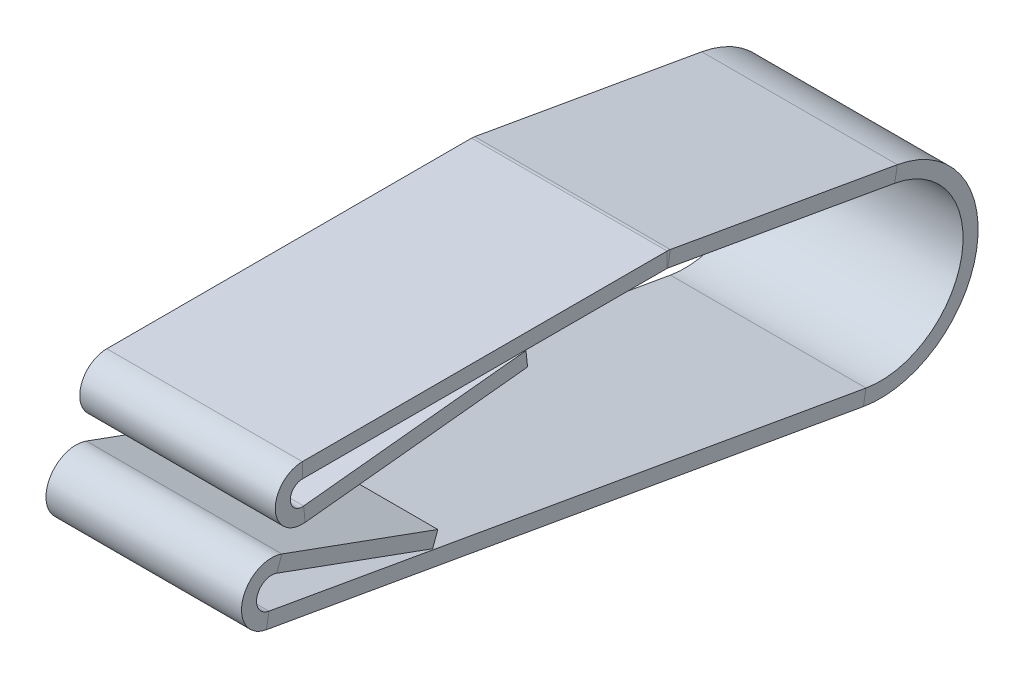
ISO-10303-21;
HEADER;
FILE_DESCRIPTION(('STEP AP214'),'2;1');
FILE_NAME('part.step','',(''),(''),'','','');
FILE_SCHEMA(('AUTOMOTIVE_DESIGN { 1 0 10303 214 1 1 1 1 }'));
ENDSEC;
DATA;
#1=APPLICATION_CONTEXT('core data for automotive mechanical design processes');
#2=APPLICATION_PROTOCOL_DEFINITION('international standard','automotive_design',2000,#1);
#3=PRODUCT_CONTEXT('',#1,'mechanical');
#4=PRODUCT('Part','Part','',(#3));
#5=PRODUCT_RELATED_PRODUCT_CATEGORY('part','',(#4));
#6=PRODUCT_DEFINITION_FORMATION('','',#4);
#7=PRODUCT_DEFINITION_CONTEXT('part definition',#1,'design');
#8=PRODUCT_DEFINITION('design','',#6,#7);
#9=PRODUCT_DEFINITION_SHAPE('','',#8);
#10=(LENGTH_UNIT() NAMED_UNIT(*) SI_UNIT(.MILLI.,.METRE.));
#11=(NAMED_UNIT(*) PLANE_ANGLE_UNIT() SI_UNIT($,.RADIAN.));
#12=(NAMED_UNIT(*) SI_UNIT($,.STERADIAN.) SOLID_ANGLE_UNIT());
#13=UNCERTAINTY_MEASURE_WITH_UNIT(LENGTH_MEASURE(1.E-05),#10,'distance_accuracy_value','');
#14=(GEOMETRIC_REPRESENTATION_CONTEXT(3) GLOBAL_UNCERTAINTY_ASSIGNED_CONTEXT((#13)) GLOBAL_UNIT_ASSIGNED_CONTEXT((#10,
#11,#12)) REPRESENTATION_CONTEXT('',''));
#15=CARTESIAN_POINT('',(0.,0.,0.));
#16=DIRECTION('',(0.,0.,1.));
#17=DIRECTION('',(1.,0.,0.));
#18=AXIS2_PLACEMENT_3D('',#15,#16,#17);
#19=CARTESIAN_POINT('',(-10.8534610219836,6.,-23.8564612972341));
#20=DIRECTION('',(1.,0.,0.));
#21=DIRECTION('',(0.,0.,-1.));
#22=AXIS2_PLACEMENT_3D('',#19,#20,#21);
#23=PLANE('',#22);
#24=DIRECTION('',(0.,0.,1.));
#25=VECTOR('',#24,1.);
#26=CARTESIAN_POINT('',(-10.8534610219836,5.5,-23.8564612972341));
#27=LINE('',#26,#25);
#28=CARTESIAN_POINT('',(-10.8534610219836,5.5,-14.3814612972341));
#29=VERTEX_POINT('',#28);
#30=CARTESIAN_POINT('',(-10.8534610219836,5.5,-26.5070840844616));
#31=VERTEX_POINT('',#30);
#32=EDGE_CURVE('E308',#29,#31,#27,.F.);
#33=ORIENTED_EDGE('',*,*,#32,.F.);
#34=DIRECTION('',(0.,1.,0.));
#35=VECTOR('',#34,1.);
#36=CARTESIAN_POINT('',(-10.8534610219836,5.50000000000003,-14.3814612972341));
#37=LINE('',#36,#35);
#38=CARTESIAN_POINT('',(-10.8534610219836,6.00000000000003,-14.3814612972341));
#39=VERTEX_POINT('',#38);
#40=EDGE_CURVE('E203',#29,#39,#37,.T.);
#41=ORIENTED_EDGE('',*,*,#40,.T.);
#42=DIRECTION('',(0.,0.,-1.));
#43=VECTOR('',#42,1.);
#44=CARTESIAN_POINT('',(-10.8534610219836,6.,-23.8564612972341));
#45=LINE('',#44,#43);
#46=CARTESIAN_POINT('',(-10.8534610219836,6.,-26.5070840844616));
#47=VERTEX_POINT('',#46);
#48=EDGE_CURVE('E228',#39,#47,#45,.T.);
#49=ORIENTED_EDGE('',*,*,#48,.T.);
#50=DIRECTION('',(0.,1.,0.));
#51=VECTOR('',#50,1.);
#52=CARTESIAN_POINT('',(-10.8534610219836,6.,-26.5070840844616));
#53=LINE('',#52,#51);
#54=EDGE_CURVE('E313',#31,#47,#53,.T.);
#55=ORIENTED_EDGE('',*,*,#54,.F.);
#56=EDGE_LOOP('',(#33,#41,#49,#55));
#57=FACE_BOUND('',#56,.T.);
#58=ADVANCED_FACE('F48',(#57),#23,.F.);
#59=CARTESIAN_POINT('',(-10.8534610219836,6.46176803203314,-23.940760637627));
#60=DIRECTION('',(1.,0.,0.));
#61=DIRECTION('',(0.,-0.173648177666931,-0.984807753012208));
#62=AXIS2_PLACEMENT_3D('',#59,#60,#61);
#63=PLANE('',#62);
#64=DIRECTION('',(0.,0.173648177666931,0.984807753012208));
#65=VECTOR('',#64,1.);
#66=CARTESIAN_POINT('',(-10.8534610219836,5.96936415552703,-23.8539365487936));
#67=LINE('',#66,#65);
#68=CARTESIAN_POINT('',(-10.8534610219835,5.49848077530122,-26.5244489022283));
#69=VERTEX_POINT('',#68);
#70=CARTESIAN_POINT('',(-10.8534610219836,4.16776431223263,-34.0713169862952));
#71=VERTEX_POINT('',#70);
#72=EDGE_CURVE('E360',#69,#71,#67,.F.);
#73=ORIENTED_EDGE('',*,*,#72,.F.);
#74=DIRECTION('',(0.,0.984807753012208,-0.173648177666931));
#75=VECTOR('',#74,1.);
#76=CARTESIAN_POINT('',(-10.8534610219836,5.99088465180732,-26.6112729910618));
#77=LINE('',#76,#75);
#78=CARTESIAN_POINT('',(-10.8534610219836,5.99088465180732,-26.6112729910618));
#79=VERTEX_POINT('',#78);
#80=EDGE_CURVE('E461',#69,#79,#77,.T.);
#81=ORIENTED_EDGE('',*,*,#80,.T.);
#82=DIRECTION('',(0.,-0.173648177666931,-0.984807753012208));
#83=VECTOR('',#82,1.);
#84=CARTESIAN_POINT('',(-10.8534610219836,6.46176803203314,-23.940760637627));
#85=LINE('',#84,#83);
#86=CARTESIAN_POINT('',(-10.8534610219836,4.66016818873873,-34.1581410751287));
#87=VERTEX_POINT('',#86);
#88=EDGE_CURVE('E52',#79,#87,#85,.T.);
#89=ORIENTED_EDGE('',*,*,#88,.T.);
#90=DIRECTION('',(0.,0.984807753012208,-0.173648177666931));
#91=VECTOR('',#90,1.);
#92=CARTESIAN_POINT('',(-10.8534610219836,4.66016818873873,-34.1581410751287));
#93=LINE('',#92,#91);
#94=EDGE_CURVE('E361',#71,#87,#93,.T.);
#95=ORIENTED_EDGE('',*,*,#94,.F.);
#96=EDGE_LOOP('',(#73,#81,#89,#95));
#97=FACE_BOUND('',#96,.T.);
#98=ADVANCED_FACE('F481',(#97),#63,.F.);
#99=CARTESIAN_POINT('',(-4.35346102198356,6.46176803203314,-23.940760637627));
#100=DIRECTION('',(-1.,0.,0.));
#101=DIRECTION('',(0.,0.173648177666931,0.984807753012208));
#102=AXIS2_PLACEMENT_3D('',#99,#100,#101);
#103=PLANE('',#102);
#104=DIRECTION('',(0.,0.173648177666931,0.984807753012208));
#105=VECTOR('',#104,1.);
#106=CARTESIAN_POINT('',(-4.35346102198356,6.46176803203314,-23.940760637627));
#107=LINE('',#106,#105);
#108=CARTESIAN_POINT('',(-4.35346102198356,4.66016818873873,-34.1581410751287));
#109=VERTEX_POINT('',#108);
#110=CARTESIAN_POINT('',(-4.35346102198356,5.99088465180732,-26.6112729910618));
#111=VERTEX_POINT('',#110);
#112=EDGE_CURVE('E356',#109,#111,#107,.T.);
#113=ORIENTED_EDGE('',*,*,#112,.T.);
#114=DIRECTION('',(0.,-0.984807753012208,0.173648177666931));
#115=VECTOR('',#114,1.);
#116=CARTESIAN_POINT('',(-4.35346102198356,5.99088465180732,-26.6112729910618));
#117=LINE('',#116,#115);
#118=CARTESIAN_POINT('',(-4.35346102198356,5.49848077530122,-26.5244489022283));
#119=VERTEX_POINT('',#118);
#120=EDGE_CURVE('E12',#111,#119,#117,.T.);
#121=ORIENTED_EDGE('',*,*,#120,.T.);
#122=DIRECTION('',(0.,0.173648177666931,0.984807753012208));
#123=VECTOR('',#122,1.);
#124=CARTESIAN_POINT('',(-4.35346102198356,5.96936415552703,-23.8539365487936));
#125=LINE('',#124,#123);
#126=CARTESIAN_POINT('',(-4.35346102198356,4.16776431223263,-34.0713169862952));
#127=VERTEX_POINT('',#126);
#128=EDGE_CURVE('E349',#127,#119,#125,.T.);
#129=ORIENTED_EDGE('',*,*,#128,.F.);
#130=DIRECTION('',(0.,0.984807753012208,-0.173648177666931));
#131=VECTOR('',#130,1.);
#132=CARTESIAN_POINT('',(-4.35346102198356,4.66016818873873,-34.1581410751287));
#133=LINE('',#132,#131);
#134=EDGE_CURVE('E365',#127,#109,#133,.T.);
#135=ORIENTED_EDGE('',*,*,#134,.T.);
#136=EDGE_LOOP('',(#113,#121,#129,#135));
#137=FACE_BOUND('',#136,.T.);
#138=ADVANCED_FACE('F50',(#137),#103,.F.);
#139=CARTESIAN_POINT('',(-7.60346102198356,6.46176803203314,-23.940760637627));
#140=DIRECTION('',(0.,0.984807753012208,-0.173648177666931));
#141=DIRECTION('',(0.,0.173648177666931,0.984807753012208));
#142=AXIS2_PLACEMENT_3D('',#139,#140,#141);
#143=PLANE('',#142);
#144=ORIENTED_EDGE('',*,*,#88,.F.);
#145=DIRECTION('',(1.,0.,0.));
#146=VECTOR('',#145,1.);
#147=CARTESIAN_POINT('',(-7.60346102198356,5.99088465180732,-26.6112729910618));
#148=LINE('',#147,#146);
#149=EDGE_CURVE('E453',#79,#111,#148,.T.);
#150=ORIENTED_EDGE('',*,*,#149,.T.);
#151=ORIENTED_EDGE('',*,*,#112,.F.);
#152=DIRECTION('',(1.,0.,0.));
#153=VECTOR('',#152,1.);
#154=CARTESIAN_POINT('',(-7.60346102198356,4.66016818873873,-34.1581410751287));
#155=LINE('',#154,#153);
#156=EDGE_CURVE('E352',#87,#109,#155,.T.);
#157=ORIENTED_EDGE('',*,*,#156,.F.);
#158=EDGE_LOOP('',(#144,#150,#151,#157));
#159=FACE_BOUND('',#158,.T.);
#160=ADVANCED_FACE('F582',(#159),#143,.T.);
#161=CARTESIAN_POINT('',(-10.8534610219836,1.93157675181497,-12.2007439440854));
#162=DIRECTION('',(-1.,0.,0.));
#163=DIRECTION('',(0.,0.173648177666931,0.984807753012208));
#164=AXIS2_PLACEMENT_3D('',#161,#162,#163);
#165=PLANE('',#164);
#166=DIRECTION('',(0.,0.173648177666931,0.984807753012208));
#167=VECTOR('',#166,1.);
#168=CARTESIAN_POINT('',(-10.8534610219836,2.42398062832107,-12.2875680329189));
#169=LINE('',#168,#167);
#170=CARTESIAN_POINT('',(-10.8534610219836,-1.24867832933452,-33.1162520091271));
#171=VERTEX_POINT('',#170);
#172=CARTESIAN_POINT('',(-10.8534610219836,2.25033245065416,-13.2723757859311));
#173=VERTEX_POINT('',#172);
#174=EDGE_CURVE('E450',#171,#173,#169,.T.);
#175=ORIENTED_EDGE('',*,*,#174,.F.);
#176=DIRECTION('',(0.,-0.984807753012208,0.173648177666931));
#177=VECTOR('',#176,1.);
#178=CARTESIAN_POINT('',(-10.8534610219836,-1.24867832933452,-33.1162520091271));
#179=LINE('',#178,#177);
#180=CARTESIAN_POINT('',(-10.8534610219836,-1.74108220584062,-33.0294279202936));
#181=VERTEX_POINT('',#180);
#182=EDGE_CURVE('E330',#171,#181,#179,.T.);
#183=ORIENTED_EDGE('',*,*,#182,.T.);
#184=DIRECTION('',(0.,0.173648177666931,0.984807753012208));
#185=VECTOR('',#184,1.);
#186=CARTESIAN_POINT('',(-10.8534610219836,1.93157675181497,-12.2007439440854));
#187=LINE('',#186,#185);
#188=CARTESIAN_POINT('',(-10.8534610219836,1.75792857414805,-13.1855516970976));
#189=VERTEX_POINT('',#188);
#190=EDGE_CURVE('E449',#181,#189,#187,.T.);
#191=ORIENTED_EDGE('',*,*,#190,.T.);
#192=DIRECTION('',(0.,-0.984807753012208,0.173648177666931));
#193=VECTOR('',#192,1.);
#194=CARTESIAN_POINT('',(-10.8534610219836,2.25033245065416,-13.2723757859311));
#195=LINE('',#194,#193);
#196=EDGE_CURVE('E394',#173,#189,#195,.T.);
#197=ORIENTED_EDGE('',*,*,#196,.F.);
#198=EDGE_LOOP('',(#175,#183,#191,#197));
#199=FACE_BOUND('',#198,.T.);
#200=ADVANCED_FACE('F495',(#199),#165,.T.);
#201=CARTESIAN_POINT('',(-4.35346102198356,1.93157675181497,-12.2007439440854));
#202=DIRECTION('',(1.,0.,0.));
#203=DIRECTION('',(0.,-0.173648177666931,-0.984807753012208));
#204=AXIS2_PLACEMENT_3D('',#201,#202,#203);
#205=PLANE('',#204);
#206=DIRECTION('',(0.,-0.984807753012208,0.173648177666931));
#207=VECTOR('',#206,1.);
#208=CARTESIAN_POINT('',(-4.35346102198356,-1.24867832933452,-33.1162520091271));
#209=LINE('',#208,#207);
#210=CARTESIAN_POINT('',(-4.35346102198356,-1.24867832933452,-33.1162520091271));
#211=VERTEX_POINT('',#210);
#212=CARTESIAN_POINT('',(-4.35346102198356,-1.74108220584062,-33.0294279202936));
#213=VERTEX_POINT('',#212);
#214=EDGE_CURVE('E345',#211,#213,#209,.T.);
#215=ORIENTED_EDGE('',*,*,#214,.F.);
#216=DIRECTION('',(0.,-0.173648177666931,-0.984807753012208));
#217=VECTOR('',#216,1.);
#218=CARTESIAN_POINT('',(-4.35346102198356,2.42398062832107,-12.2875680329189));
#219=LINE('',#218,#217);
#220=CARTESIAN_POINT('',(-4.35346102198356,2.25033245065414,-13.2723757859311));
#221=VERTEX_POINT('',#220);
#222=EDGE_CURVE('E443',#221,#211,#219,.T.);
#223=ORIENTED_EDGE('',*,*,#222,.F.);
#224=DIRECTION('',(0.,-0.984807753012208,0.173648177666931));
#225=VECTOR('',#224,1.);
#226=CARTESIAN_POINT('',(-4.35346102198356,2.25033245065416,-13.2723757859311));
#227=LINE('',#226,#225);
#228=CARTESIAN_POINT('',(-4.35346102198356,1.75792857414803,-13.1855516970976));
#229=VERTEX_POINT('',#228);
#230=EDGE_CURVE('E379',#221,#229,#227,.T.);
#231=ORIENTED_EDGE('',*,*,#230,.T.);
#232=DIRECTION('',(0.,-0.173648177666931,-0.984807753012208));
#233=VECTOR('',#232,1.);
#234=CARTESIAN_POINT('',(-4.35346102198356,1.93157675181497,-12.2007439440854));
#235=LINE('',#234,#233);
#236=EDGE_CURVE('E446',#229,#213,#235,.T.);
#237=ORIENTED_EDGE('',*,*,#236,.T.);
#238=EDGE_LOOP('',(#215,#223,#231,#237));
#239=FACE_BOUND('',#238,.T.);
#240=ADVANCED_FACE('F511',(#239),#205,.T.);
#241=CARTESIAN_POINT('',(0.,4.20314866730016,0.681980562159884));
#242=DIRECTION('',(0.,0.984807753012208,-0.173648177666931));
#243=DIRECTION('',(0.,0.173648177666931,0.984807753012208));
#244=AXIS2_PLACEMENT_3D('',#241,#242,#243);
#245=PLANE('',#244);
#246=ORIENTED_EDGE('',*,*,#190,.F.);
#247=DIRECTION('',(-1.,0.,0.));
#248=VECTOR('',#247,1.);
#249=CARTESIAN_POINT('',(-10.8534610219836,-1.74108220584062,-33.0294279202936));
#250=LINE('',#249,#248);
#251=EDGE_CURVE('E321',#181,#213,#250,.F.);
#252=ORIENTED_EDGE('',*,*,#251,.T.);
#253=ORIENTED_EDGE('',*,*,#236,.F.);
#254=DIRECTION('',(1.,0.,0.));
#255=VECTOR('',#254,1.);
#256=CARTESIAN_POINT('',(-4.35346102198356,1.75792857414805,-13.1855516970976));
#257=LINE('',#256,#255);
#258=EDGE_CURVE('E370',#229,#189,#257,.F.);
#259=ORIENTED_EDGE('',*,*,#258,.T.);
#260=EDGE_LOOP('',(#246,#252,#253,#259));
#261=FACE_BOUND('',#260,.T.);
#262=ADVANCED_FACE('F499',(#261),#245,.F.);
#263=CARTESIAN_POINT('',(0.,4.69555254380626,0.595156473326419));
#264=DIRECTION('',(0.,0.984807753012208,-0.173648177666931));
#265=DIRECTION('',(0.,0.173648177666931,0.984807753012208));
#266=AXIS2_PLACEMENT_3D('',#263,#264,#265);
#267=PLANE('',#266);
#268=DIRECTION('',(-1.,0.,0.));
#269=VECTOR('',#268,1.);
#270=CARTESIAN_POINT('',(-10.8534610219836,-1.24867832933452,-33.1162520091271));
#271=LINE('',#270,#269);
#272=EDGE_CURVE('E338',#171,#211,#271,.F.);
#273=ORIENTED_EDGE('',*,*,#272,.F.);
#274=ORIENTED_EDGE('',*,*,#174,.T.);
#275=DIRECTION('',(1.,0.,0.));
#276=VECTOR('',#275,1.);
#277=CARTESIAN_POINT('',(-4.35346102198356,2.25033245065416,-13.2723757859311));
#278=LINE('',#277,#276);
#279=EDGE_CURVE('E387',#221,#173,#278,.F.);
#280=ORIENTED_EDGE('',*,*,#279,.F.);
#281=ORIENTED_EDGE('',*,*,#222,.T.);
#282=EDGE_LOOP('',(#273,#274,#280,#281));
#283=FACE_BOUND('',#282,.T.);
#284=ADVANCED_FACE('F514',(#283),#267,.T.);
#285=CARTESIAN_POINT('',(-4.35346102198356,2.73930393057607,-16.2924347070372));
#286=DIRECTION('',(-1.,0.,0.));
#287=DIRECTION('',(0.,0.342020143325677,0.939692620785905));
#288=AXIS2_PLACEMENT_3D('',#285,#286,#287);
#289=PLANE('',#288);
#290=DIRECTION('',(0.,0.939692620785905,-0.342020143325677));
#291=VECTOR('',#290,1.);
#292=CARTESIAN_POINT('',(-4.35346102198356,3.68242894794615,-13.7012200180903));
#293=LINE('',#292,#291);
#294=CARTESIAN_POINT('',(-4.35346102198356,3.2125826375532,-13.5302099464274));
#295=VERTEX_POINT('',#294);
#296=CARTESIAN_POINT('',(-4.35346102198356,3.68242894794615,-13.7012200180903));
#297=VERTEX_POINT('',#296);
#298=EDGE_CURVE('E435',#295,#297,#293,.T.);
#299=ORIENTED_EDGE('',*,*,#298,.F.);
#300=DIRECTION('',(0.,0.342020143325677,0.939692620785905));
#301=VECTOR('',#300,1.);
#302=CARTESIAN_POINT('',(-4.35346102198356,2.26945762018312,-16.1214246353744));
#303=LINE('',#302,#301);
#304=CARTESIAN_POINT('',(-4.35346102198356,1.32633260281305,-18.7126393243213));
#305=VERTEX_POINT('',#304);
#306=EDGE_CURVE('E422',#305,#295,#303,.T.);
#307=ORIENTED_EDGE('',*,*,#306,.F.);
#308=DIRECTION('',(0.,0.939692620785905,-0.342020143325677));
#309=VECTOR('',#308,1.);
#310=CARTESIAN_POINT('',(-4.35346102198356,1.796178913206,-18.8836493959842));
#311=LINE('',#310,#309);
#312=CARTESIAN_POINT('',(-4.35346102198356,1.796178913206,-18.8836493959842));
#313=VERTEX_POINT('',#312);
#314=EDGE_CURVE('E432',#305,#313,#311,.T.);
#315=ORIENTED_EDGE('',*,*,#314,.T.);
#316=DIRECTION('',(0.,0.342020143325677,0.939692620785905));
#317=VECTOR('',#316,1.);
#318=CARTESIAN_POINT('',(-4.35346102198356,2.73930393057607,-16.2924347070372));
#319=LINE('',#318,#317);
#320=EDGE_CURVE('E406',#313,#297,#319,.T.);
#321=ORIENTED_EDGE('',*,*,#320,.T.);
#322=EDGE_LOOP('',(#299,#307,#315,#321));
#323=FACE_BOUND('',#322,.T.);
#324=ADVANCED_FACE('F535',(#323),#289,.F.);
#325=CARTESIAN_POINT('',(-7.60346102198356,1.796178913206,-18.8836493959842));
#326=DIRECTION('',(0.,0.342020143325677,0.939692620785905));
#327=DIRECTION('',(1.,0.,0.));
#328=AXIS2_PLACEMENT_3D('',#325,#326,#327);
#329=PLANE('',#328);
#330=ORIENTED_EDGE('',*,*,#314,.F.);
#331=DIRECTION('',(1.,0.,0.));
#332=VECTOR('',#331,1.);
#333=CARTESIAN_POINT('',(-7.60346102198356,1.32633260281305,-18.7126393243213));
#334=LINE('',#333,#332);
#335=CARTESIAN_POINT('',(-10.8534610219836,1.32633260281305,-18.7126393243213));
#336=VERTEX_POINT('',#335);
#337=EDGE_CURVE('E418',#336,#305,#334,.T.);
#338=ORIENTED_EDGE('',*,*,#337,.F.);
#339=DIRECTION('',(0.,0.939692620785905,-0.342020143325677));
#340=VECTOR('',#339,1.);
#341=CARTESIAN_POINT('',(-10.8534610219836,1.796178913206,-18.8836493959842));
#342=LINE('',#341,#340);
#343=CARTESIAN_POINT('',(-10.8534610219836,1.796178913206,-18.8836493959842));
#344=VERTEX_POINT('',#343);
#345=EDGE_CURVE('E405',#336,#344,#342,.T.);
#346=ORIENTED_EDGE('',*,*,#345,.T.);
#347=DIRECTION('',(1.,0.,0.));
#348=VECTOR('',#347,1.);
#349=CARTESIAN_POINT('',(-7.60346102198356,1.796178913206,-18.8836493959842));
#350=LINE('',#349,#348);
#351=EDGE_CURVE('E401',#344,#313,#350,.T.);
#352=ORIENTED_EDGE('',*,*,#351,.T.);
#353=EDGE_LOOP('',(#330,#338,#346,#352));
#354=FACE_BOUND('',#353,.T.);
#355=ADVANCED_FACE('F596',(#354),#329,.F.);
#356=CARTESIAN_POINT('',(-10.8534610219836,2.73930393057607,-16.2924347070372));
#357=DIRECTION('',(1.,0.,0.));
#358=DIRECTION('',(0.,-0.342020143325677,-0.939692620785905));
#359=AXIS2_PLACEMENT_3D('',#356,#357,#358);
#360=PLANE('',#359);
#361=DIRECTION('',(0.,0.342020143325677,0.939692620785905));
#362=VECTOR('',#361,1.);
#363=CARTESIAN_POINT('',(-10.8534610219836,2.26945762018312,-16.1214246353744));
#364=LINE('',#363,#362);
#365=CARTESIAN_POINT('',(-10.8534610219836,3.2125826375532,-13.5302099464274));
#366=VERTEX_POINT('',#365);
#367=EDGE_CURVE('E398',#366,#336,#364,.F.);
#368=ORIENTED_EDGE('',*,*,#367,.F.);
#369=DIRECTION('',(0.,0.939692620785905,-0.342020143325677));
#370=VECTOR('',#369,1.);
#371=CARTESIAN_POINT('',(-10.8534610219836,3.68242894794615,-13.7012200180903));
#372=LINE('',#371,#370);
#373=CARTESIAN_POINT('',(-10.8534610219836,3.68242894794615,-13.7012200180903));
#374=VERTEX_POINT('',#373);
#375=EDGE_CURVE('E439',#366,#374,#372,.T.);
#376=ORIENTED_EDGE('',*,*,#375,.T.);
#377=DIRECTION('',(0.,-0.342020143325677,-0.939692620785905));
#378=VECTOR('',#377,1.);
#379=CARTESIAN_POINT('',(-10.8534610219836,2.73930393057607,-16.2924347070372));
#380=LINE('',#379,#378);
#381=EDGE_CURVE('E414',#374,#344,#380,.T.);
#382=ORIENTED_EDGE('',*,*,#381,.T.);
#383=ORIENTED_EDGE('',*,*,#345,.F.);
#384=EDGE_LOOP('',(#368,#376,#382,#383));
#385=FACE_BOUND('',#384,.T.);
#386=ADVANCED_FACE('F526',(#385),#360,.F.);
#387=CARTESIAN_POINT('',(-7.60346102198356,2.73930393057607,-16.2924347070372));
#388=DIRECTION('',(0.,0.939692620785905,-0.342020143325677));
#389=DIRECTION('',(0.,0.342020143325677,0.939692620785905));
#390=AXIS2_PLACEMENT_3D('',#387,#388,#389);
#391=PLANE('',#390);
#392=ORIENTED_EDGE('',*,*,#351,.F.);
#393=ORIENTED_EDGE('',*,*,#381,.F.);
#394=DIRECTION('',(-1.,0.,0.));
#395=VECTOR('',#394,1.);
#396=CARTESIAN_POINT('',(-7.60346102198356,3.68242894794615,-13.7012200180903));
#397=LINE('',#396,#395);
#398=EDGE_CURVE('E410',#297,#374,#397,.T.);
#399=ORIENTED_EDGE('',*,*,#398,.F.);
#400=ORIENTED_EDGE('',*,*,#320,.F.);
#401=EDGE_LOOP('',(#392,#393,#399,#400));
#402=FACE_BOUND('',#401,.T.);
#403=ADVANCED_FACE('F533',(#402),#391,.T.);
#404=CARTESIAN_POINT('',(-7.60346102198356,2.26945762018312,-16.1214246353744));
#405=DIRECTION('',(0.,0.939692620785905,-0.342020143325677));
#406=DIRECTION('',(0.,0.342020143325677,0.939692620785905));
#407=AXIS2_PLACEMENT_3D('',#404,#405,#406);
#408=PLANE('',#407);
#409=ORIENTED_EDGE('',*,*,#337,.T.);
#410=ORIENTED_EDGE('',*,*,#306,.T.);
#411=DIRECTION('',(1.,0.,0.));
#412=VECTOR('',#411,1.);
#413=CARTESIAN_POINT('',(-7.60346102198356,3.2125826375532,-13.5302099464274));
#414=LINE('',#413,#412);
#415=EDGE_CURVE('E426',#295,#366,#414,.F.);
#416=ORIENTED_EDGE('',*,*,#415,.T.);
#417=ORIENTED_EDGE('',*,*,#367,.T.);
#418=EDGE_LOOP('',(#409,#410,#416,#417));
#419=FACE_BOUND('',#418,.T.);
#420=ADVANCED_FACE('F546',(#419),#408,.F.);
#421=CARTESIAN_POINT('',(-10.8534610219836,2.74273632716025,-13.3591998747646));
#422=DIRECTION('',(-1.,0.,0.));
#423=DIRECTION('',(0.,-0.984807753012208,0.173648177666931));
#424=AXIS2_PLACEMENT_3D('',#421,#422,#423);
#425=PLANE('',#424);
#426=ORIENTED_EDGE('',*,*,#375,.F.);
#427=CARTESIAN_POINT('',(-10.8534610219836,2.74273632716025,-13.3591998747646));
#428=DIRECTION('',(1.,0.,0.));
#429=DIRECTION('',(0.,0.984807753012208,-0.173648177666931));
#430=AXIS2_PLACEMENT_3D('',#427,#428,#429);
#431=CIRCLE('',#430,0.49999999999999);
#432=EDGE_CURVE('E383',#173,#366,#431,.F.);
#433=ORIENTED_EDGE('',*,*,#432,.F.);
#434=ORIENTED_EDGE('',*,*,#196,.T.);
#435=CARTESIAN_POINT('',(-10.8534610219836,2.74273632716025,-13.3591998747646));
#436=DIRECTION('',(1.,0.,0.));
#437=DIRECTION('',(0.,0.984807753012208,-0.173648177666931));
#438=AXIS2_PLACEMENT_3D('',#435,#436,#437);
#439=CIRCLE('',#438,0.99999999999999);
#440=EDGE_CURVE('E374',#189,#374,#439,.F.);
#441=ORIENTED_EDGE('',*,*,#440,.T.);
#442=EDGE_LOOP('',(#426,#433,#434,#441));
#443=FACE_BOUND('',#442,.T.);
#444=ADVANCED_FACE('F522',(#443),#425,.T.);
#445=CARTESIAN_POINT('',(-4.35346102198356,2.74273632716025,-13.3591998747646));
#446=DIRECTION('',(-1.,0.,0.));
#447=DIRECTION('',(0.,-0.984807753012208,0.173648177666931));
#448=AXIS2_PLACEMENT_3D('',#445,#446,#447);
#449=PLANE('',#448);
#450=CARTESIAN_POINT('',(-4.35346102198356,2.74273632716025,-13.3591998747646));
#451=DIRECTION('',(1.,0.,0.));
#452=DIRECTION('',(0.,0.984807753012208,-0.173648177666931));
#453=AXIS2_PLACEMENT_3D('',#450,#451,#452);
#454=CIRCLE('',#453,0.49999999999999);
#455=EDGE_CURVE('E369',#295,#221,#454,.T.);
#456=ORIENTED_EDGE('',*,*,#455,.F.);
#457=ORIENTED_EDGE('',*,*,#298,.T.);
#458=CARTESIAN_POINT('',(-4.35346102198356,2.74273632716025,-13.3591998747646));
#459=DIRECTION('',(1.,0.,0.));
#460=DIRECTION('',(0.,0.984807753012208,-0.173648177666931));
#461=AXIS2_PLACEMENT_3D('',#458,#459,#460);
#462=CIRCLE('',#461,0.99999999999999);
#463=EDGE_CURVE('E375',#297,#229,#462,.T.);
#464=ORIENTED_EDGE('',*,*,#463,.T.);
#465=ORIENTED_EDGE('',*,*,#230,.F.);
#466=EDGE_LOOP('',(#456,#457,#464,#465));
#467=FACE_BOUND('',#466,.T.);
#468=ADVANCED_FACE('F538',(#467),#449,.F.);
#469=CARTESIAN_POINT('',(-4.35346102198356,2.74273632716025,-13.3591998747646));
#470=DIRECTION('',(1.,0.,0.));
#471=DIRECTION('',(0.,0.939692620785905,-0.342020143325677));
#472=AXIS2_PLACEMENT_3D('',#469,#470,#471);
#473=CYLINDRICAL_SURFACE('',#472,0.99999999999999);
#474=ORIENTED_EDGE('',*,*,#258,.F.);
#475=ORIENTED_EDGE('',*,*,#463,.F.);
#476=ORIENTED_EDGE('',*,*,#398,.T.);
#477=ORIENTED_EDGE('',*,*,#440,.F.);
#478=EDGE_LOOP('',(#474,#475,#476,#477));
#479=FACE_BOUND('',#478,.T.);
#480=ADVANCED_FACE('F530',(#479),#473,.T.);
#481=CARTESIAN_POINT('',(-4.35346102198356,2.74273632716025,-13.3591998747646));
#482=DIRECTION('',(1.,0.,0.));
#483=DIRECTION('',(0.,0.939692620785905,-0.342020143325677));
#484=AXIS2_PLACEMENT_3D('',#481,#482,#483);
#485=CYLINDRICAL_SURFACE('',#484,0.49999999999999);
#486=ORIENTED_EDGE('',*,*,#279,.T.);
#487=ORIENTED_EDGE('',*,*,#432,.T.);
#488=ORIENTED_EDGE('',*,*,#415,.F.);
#489=ORIENTED_EDGE('',*,*,#455,.T.);
#490=EDGE_LOOP('',(#486,#487,#488,#489));
#491=FACE_BOUND('',#490,.T.);
#492=ADVANCED_FACE('F517',(#491),#485,.F.);
#493=CARTESIAN_POINT('',(-7.60346102198356,5.96936415552703,-23.8539365487936));
#494=DIRECTION('',(0.,0.984807753012208,-0.173648177666931));
#495=DIRECTION('',(0.,0.173648177666931,0.984807753012208));
#496=AXIS2_PLACEMENT_3D('',#493,#494,#495);
#497=PLANE('',#496);
#498=DIRECTION('',(1.,0.,0.));
#499=VECTOR('',#498,1.);
#500=CARTESIAN_POINT('',(-7.60346102198356,5.49848077530122,-26.5244489022283));
#501=LINE('',#500,#499);
#502=EDGE_CURVE('E58',#69,#119,#501,.T.);
#503=ORIENTED_EDGE('',*,*,#502,.F.);
#504=ORIENTED_EDGE('',*,*,#72,.T.);
#505=DIRECTION('',(1.,0.,0.));
#506=VECTOR('',#505,1.);
#507=CARTESIAN_POINT('',(-7.60346102198356,4.16776431223263,-34.0713169862952));
#508=LINE('',#507,#506);
#509=EDGE_CURVE('E357',#71,#127,#508,.T.);
#510=ORIENTED_EDGE('',*,*,#509,.T.);
#511=ORIENTED_EDGE('',*,*,#128,.T.);
#512=EDGE_LOOP('',(#503,#504,#510,#511));
#513=FACE_BOUND('',#512,.T.);
#514=ADVANCED_FACE('F477',(#513),#497,.F.);
#515=CARTESIAN_POINT('',(-4.35346102198356,1.45954299144906,-33.5937844977112));
#516=DIRECTION('',(1.,0.,0.));
#517=DIRECTION('',(0.,-0.173648177666931,-0.984807753012208));
#518=AXIS2_PLACEMENT_3D('',#515,#516,#517);
#519=PLANE('',#518);
#520=ORIENTED_EDGE('',*,*,#134,.F.);
#521=CARTESIAN_POINT('',(-4.35346102198356,1.45954299144906,-33.5937844977112));
#522=DIRECTION('',(-1.,0.,0.));
#523=DIRECTION('',(0.,0.173648177666931,0.984807753012208));
#524=AXIS2_PLACEMENT_3D('',#521,#522,#523);
#525=CIRCLE('',#524,2.75);
#526=EDGE_CURVE('E334',#211,#127,#525,.F.);
#527=ORIENTED_EDGE('',*,*,#526,.F.);
#528=ORIENTED_EDGE('',*,*,#214,.T.);
#529=CARTESIAN_POINT('',(-4.35346102198356,1.45954299144906,-33.5937844977112));
#530=DIRECTION('',(-1.,0.,0.));
#531=DIRECTION('',(0.,0.173648177666931,0.984807753012208));
#532=AXIS2_PLACEMENT_3D('',#529,#530,#531);
#533=CIRCLE('',#532,3.25);
#534=EDGE_CURVE('E325',#213,#109,#533,.F.);
#535=ORIENTED_EDGE('',*,*,#534,.T.);
#536=EDGE_LOOP('',(#520,#527,#528,#535));
#537=FACE_BOUND('',#536,.T.);
#538=ADVANCED_FACE('F507',(#537),#519,.T.);
#539=CARTESIAN_POINT('',(-10.8534610219836,1.45954299144906,-33.5937844977112));
#540=DIRECTION('',(1.,0.,0.));
#541=DIRECTION('',(0.,-0.173648177666931,-0.984807753012208));
#542=AXIS2_PLACEMENT_3D('',#539,#540,#541);
#543=PLANE('',#542);
#544=CARTESIAN_POINT('',(-10.8534610219836,1.45954299144906,-33.5937844977112));
#545=DIRECTION('',(-1.,0.,0.));
#546=DIRECTION('',(0.,0.173648177666931,0.984807753012208));
#547=AXIS2_PLACEMENT_3D('',#544,#545,#546);
#548=CIRCLE('',#547,2.75);
#549=EDGE_CURVE('E223',#71,#171,#548,.T.);
#550=ORIENTED_EDGE('',*,*,#549,.F.);
#551=ORIENTED_EDGE('',*,*,#94,.T.);
#552=CARTESIAN_POINT('',(-10.8534610219836,1.45954299144906,-33.5937844977112));
#553=DIRECTION('',(-1.,0.,0.));
#554=DIRECTION('',(0.,0.173648177666931,0.984807753012208));
#555=AXIS2_PLACEMENT_3D('',#552,#553,#554);
#556=CIRCLE('',#555,3.25);
#557=EDGE_CURVE('E326',#87,#181,#556,.T.);
#558=ORIENTED_EDGE('',*,*,#557,.T.);
#559=ORIENTED_EDGE('',*,*,#182,.F.);
#560=EDGE_LOOP('',(#550,#551,#558,#559));
#561=FACE_BOUND('',#560,.T.);
#562=ADVANCED_FACE('F491',(#561),#543,.F.);
#563=CARTESIAN_POINT('',(-10.8534610219836,1.45954299144906,-33.5937844977112));
#564=DIRECTION('',(-1.,0.,0.));
#565=DIRECTION('',(0.,0.984807753012208,-0.173648177666931));
#566=AXIS2_PLACEMENT_3D('',#563,#564,#565);
#567=CYLINDRICAL_SURFACE('',#566,3.25);
#568=ORIENTED_EDGE('',*,*,#251,.F.);
#569=ORIENTED_EDGE('',*,*,#557,.F.);
#570=ORIENTED_EDGE('',*,*,#156,.T.);
#571=ORIENTED_EDGE('',*,*,#534,.F.);
#572=EDGE_LOOP('',(#568,#569,#570,#571));
#573=FACE_BOUND('',#572,.T.);
#574=ADVANCED_FACE('F504',(#573),#567,.T.);
#575=CARTESIAN_POINT('',(-10.8534610219836,1.45954299144906,-33.5937844977112));
#576=DIRECTION('',(-1.,0.,0.));
#577=DIRECTION('',(0.,0.984807753012208,-0.173648177666931));
#578=AXIS2_PLACEMENT_3D('',#575,#576,#577);
#579=CYLINDRICAL_SURFACE('',#578,2.75);
#580=ORIENTED_EDGE('',*,*,#272,.T.);
#581=ORIENTED_EDGE('',*,*,#526,.T.);
#582=ORIENTED_EDGE('',*,*,#509,.F.);
#583=ORIENTED_EDGE('',*,*,#549,.T.);
#584=EDGE_LOOP('',(#580,#581,#582,#583));
#585=FACE_BOUND('',#584,.T.);
#586=ADVANCED_FACE('F488',(#585),#579,.F.);
#587=CARTESIAN_POINT('',(-7.60346102198356,6.,-23.8564612972341));
#588=DIRECTION('',(0.,1.,0.));
#589=DIRECTION('',(0.,0.,1.));
#590=AXIS2_PLACEMENT_3D('',#587,#588,#589);
#591=PLANE('',#590);
#592=DIRECTION('',(-1.,0.,0.));
#593=VECTOR('',#592,1.);
#594=CARTESIAN_POINT('',(-10.8534610219836,6.00000000000003,-14.3814612972341));
#595=LINE('',#594,#593);
#596=CARTESIAN_POINT('',(-4.35346102198356,6.00000000000003,-14.3814612972341));
#597=VERTEX_POINT('',#596);
#598=EDGE_CURVE('E210',#39,#597,#595,.F.);
#599=ORIENTED_EDGE('',*,*,#598,.T.);
#600=DIRECTION('',(0.,0.,1.));
#601=VECTOR('',#600,1.);
#602=CARTESIAN_POINT('',(-4.35346102198356,6.,-23.8564612972341));
#603=LINE('',#602,#601);
#604=CARTESIAN_POINT('',(-4.35346102198356,6.,-26.5070840844616));
#605=VERTEX_POINT('',#604);
#606=EDGE_CURVE('E216',#605,#597,#603,.T.);
#607=ORIENTED_EDGE('',*,*,#606,.F.);
#608=DIRECTION('',(1.,0.,0.));
#609=VECTOR('',#608,1.);
#610=CARTESIAN_POINT('',(-7.60346102198356,6.,-26.5070840844616));
#611=LINE('',#610,#609);
#612=EDGE_CURVE('E295',#47,#605,#611,.T.);
#613=ORIENTED_EDGE('',*,*,#612,.F.);
#614=ORIENTED_EDGE('',*,*,#48,.F.);
#615=EDGE_LOOP('',(#599,#607,#613,#614));
#616=FACE_BOUND('',#615,.T.);
#617=ADVANCED_FACE('F227',(#616),#591,.T.);
#618=CARTESIAN_POINT('',(-7.60346102198356,5.5,-23.8564612972341));
#619=DIRECTION('',(0.,1.,0.));
#620=DIRECTION('',(0.,0.,1.));
#621=AXIS2_PLACEMENT_3D('',#618,#619,#620);
#622=PLANE('',#621);
#623=DIRECTION('',(0.,0.,1.));
#624=VECTOR('',#623,1.);
#625=CARTESIAN_POINT('',(-4.35346102198356,5.5,-23.8564612972341));
#626=LINE('',#625,#624);
#627=CARTESIAN_POINT('',(-4.35346102198356,5.5,-26.5070840844616));
#628=VERTEX_POINT('',#627);
#629=CARTESIAN_POINT('',(-4.35346102198356,5.50000000000003,-14.3814612972341));
#630=VERTEX_POINT('',#629);
#631=EDGE_CURVE('E224',#628,#630,#626,.T.);
#632=ORIENTED_EDGE('',*,*,#631,.T.);
#633=DIRECTION('',(-1.,0.,0.));
#634=VECTOR('',#633,1.);
#635=CARTESIAN_POINT('',(-10.8534610219836,5.50000000000003,-14.3814612972341));
#636=LINE('',#635,#634);
#637=EDGE_CURVE('E237',#29,#630,#636,.F.);
#638=ORIENTED_EDGE('',*,*,#637,.F.);
#639=ORIENTED_EDGE('',*,*,#32,.T.);
#640=DIRECTION('',(1.,0.,0.));
#641=VECTOR('',#640,1.);
#642=CARTESIAN_POINT('',(-7.60346102198356,5.5,-26.5070840844616));
#643=LINE('',#642,#641);
#644=EDGE_CURVE('E304',#31,#628,#643,.T.);
#645=ORIENTED_EDGE('',*,*,#644,.T.);
#646=EDGE_LOOP('',(#632,#638,#639,#645));
#647=FACE_BOUND('',#646,.T.);
#648=ADVANCED_FACE('F560',(#647),#622,.F.);
#649=CARTESIAN_POINT('',(-4.35346102198356,6.,-23.8564612972341));
#650=DIRECTION('',(-1.,0.,0.));
#651=DIRECTION('',(0.,0.,1.));
#652=AXIS2_PLACEMENT_3D('',#649,#650,#651);
#653=PLANE('',#652);
#654=DIRECTION('',(0.,1.,0.));
#655=VECTOR('',#654,1.);
#656=CARTESIAN_POINT('',(-4.35346102198356,5.50000000000003,-14.3814612972341));
#657=LINE('',#656,#655);
#658=EDGE_CURVE('E191',#630,#597,#657,.T.);
#659=ORIENTED_EDGE('',*,*,#658,.F.);
#660=ORIENTED_EDGE('',*,*,#631,.F.);
#661=DIRECTION('',(0.,-1.,0.));
#662=VECTOR('',#661,1.);
#663=CARTESIAN_POINT('',(-4.35346102198356,6.,-26.5070840844616));
#664=LINE('',#663,#662);
#665=EDGE_CURVE('E219',#605,#628,#664,.T.);
#666=ORIENTED_EDGE('',*,*,#665,.F.);
#667=ORIENTED_EDGE('',*,*,#606,.T.);
#668=EDGE_LOOP('',(#659,#660,#666,#667));
#669=FACE_BOUND('',#668,.T.);
#670=ADVANCED_FACE('F217',(#669),#653,.F.);
#671=CARTESIAN_POINT('',(-10.8534610219836,5.4,-26.5070840844616));
#672=DIRECTION('',(-1.,0.,0.));
#673=DIRECTION('',(0.,0.,1.));
#674=AXIS2_PLACEMENT_3D('',#671,#672,#673);
#675=PLANE('',#674);
#676=ORIENTED_EDGE('',*,*,#80,.F.);
#677=CARTESIAN_POINT('',(-10.8534610219836,5.4,-26.5070840844616));
#678=DIRECTION('',(-1.,0.,0.));
#679=DIRECTION('',(0.,0.,1.));
#680=AXIS2_PLACEMENT_3D('',#677,#678,#679);
#681=CIRCLE('',#680,0.1);
#682=EDGE_CURVE('E285',#69,#31,#681,.F.);
#683=ORIENTED_EDGE('',*,*,#682,.T.);
#684=ORIENTED_EDGE('',*,*,#54,.T.);
#685=CARTESIAN_POINT('',(-10.8534610219836,5.4,-26.5070840844616));
#686=DIRECTION('',(1.,0.,0.));
#687=DIRECTION('',(0.,0.,1.));
#688=AXIS2_PLACEMENT_3D('',#685,#686,#687);
#689=CIRCLE('',#688,0.6);
#690=EDGE_CURVE('E288',#79,#47,#689,.T.);
#691=ORIENTED_EDGE('',*,*,#690,.F.);
#692=EDGE_LOOP('',(#676,#683,#684,#691));
#693=FACE_BOUND('',#692,.T.);
#694=ADVANCED_FACE('F566',(#693),#675,.T.);
#695=CARTESIAN_POINT('',(-4.35346102198356,5.4,-26.5070840844616));
#696=DIRECTION('',(1.,0.,0.));
#697=DIRECTION('',(0.,0.,-1.));
#698=AXIS2_PLACEMENT_3D('',#695,#696,#697);
#699=PLANE('',#698);
#700=CARTESIAN_POINT('',(-4.35346102198356,5.4,-26.5070840844616));
#701=DIRECTION('',(-1.,0.,0.));
#702=DIRECTION('',(0.,0.,1.));
#703=AXIS2_PLACEMENT_3D('',#700,#701,#702);
#704=CIRCLE('',#703,0.1);
#705=EDGE_CURVE('E292',#628,#119,#704,.T.);
#706=ORIENTED_EDGE('',*,*,#705,.T.);
#707=ORIENTED_EDGE('',*,*,#120,.F.);
#708=CARTESIAN_POINT('',(-4.35346102198356,5.4,-26.5070840844616));
#709=DIRECTION('',(-1.,0.,0.));
#710=DIRECTION('',(0.,0.,-1.));
#711=AXIS2_PLACEMENT_3D('',#708,#709,#710);
#712=CIRCLE('',#711,0.6);
#713=EDGE_CURVE('E74',#605,#111,#712,.T.);
#714=ORIENTED_EDGE('',*,*,#713,.F.);
#715=ORIENTED_EDGE('',*,*,#665,.T.);
#716=EDGE_LOOP('',(#706,#707,#714,#715));
#717=FACE_BOUND('',#716,.T.);
#718=ADVANCED_FACE('F680',(#717),#699,.T.);
#719=CARTESIAN_POINT('',(-1.08397242521522,5.4,-26.5070840844616));
#720=DIRECTION('',(-1.,0.,0.));
#721=DIRECTION('',(0.,0.,1.));
#722=AXIS2_PLACEMENT_3D('',#719,#720,#721);
#723=CYLINDRICAL_SURFACE('',#722,0.6);
#724=ORIENTED_EDGE('',*,*,#612,.T.);
#725=ORIENTED_EDGE('',*,*,#713,.T.);
#726=ORIENTED_EDGE('',*,*,#149,.F.);
#727=ORIENTED_EDGE('',*,*,#690,.T.);
#728=EDGE_LOOP('',(#724,#725,#726,#727));
#729=FACE_BOUND('',#728,.T.);
#730=ADVANCED_FACE('F692',(#729),#723,.T.);
#731=CARTESIAN_POINT('',(-1.08397242521522,5.4,-26.5070840844616));
#732=DIRECTION('',(-1.,0.,0.));
#733=DIRECTION('',(0.,0.,1.));
#734=AXIS2_PLACEMENT_3D('',#731,#732,#733);
#735=CYLINDRICAL_SURFACE('',#734,0.1);
#736=ORIENTED_EDGE('',*,*,#644,.F.);
#737=ORIENTED_EDGE('',*,*,#682,.F.);
#738=ORIENTED_EDGE('',*,*,#502,.T.);
#739=ORIENTED_EDGE('',*,*,#705,.F.);
#740=EDGE_LOOP('',(#736,#737,#738,#739));
#741=FACE_BOUND('',#740,.T.);
#742=ADVANCED_FACE('F702',(#741),#735,.F.);
#743=CARTESIAN_POINT('',(-10.8534610219836,4.59338182691549,-18.1714063695306));
#744=DIRECTION('',(1.,0.,0.));
#745=DIRECTION('',(0.,-0.104528463267659,0.994521895368273));
#746=AXIS2_PLACEMENT_3D('',#743,#744,#745);
#747=PLANE('',#746);
#748=DIRECTION('',(0.,-0.994521895368273,-0.104528463267659));
#749=VECTOR('',#748,1.);
#750=CARTESIAN_POINT('',(-10.8534610219836,4.20493029416856,-14.475536914175));
#751=LINE('',#750,#749);
#752=CARTESIAN_POINT('',(-10.8534610219836,4.70219124185269,-14.4232726825412));
#753=VERTEX_POINT('',#752);
#754=CARTESIAN_POINT('',(-10.8534610219836,4.20493029416856,-14.475536914175));
#755=VERTEX_POINT('',#754);
#756=EDGE_CURVE('E277',#753,#755,#751,.T.);
#757=ORIENTED_EDGE('',*,*,#756,.F.);
#758=DIRECTION('',(0.,0.104528463267659,-0.994521895368273));
#759=VECTOR('',#758,1.);
#760=CARTESIAN_POINT('',(-10.8534610219836,5.09064277459963,-18.1191421378967));
#761=LINE('',#760,#759);
#762=CARTESIAN_POINT('',(-10.8534610219836,5.47909430734657,-21.8150115932523));
#763=VERTEX_POINT('',#762);
#764=EDGE_CURVE('E264',#763,#753,#761,.F.);
#765=ORIENTED_EDGE('',*,*,#764,.F.);
#766=DIRECTION('',(0.,-0.994521895368273,-0.104528463267659));
#767=VECTOR('',#766,1.);
#768=CARTESIAN_POINT('',(-10.8534610219836,4.98183335966243,-21.8672758248861));
#769=LINE('',#768,#767);
#770=CARTESIAN_POINT('',(-10.8534610219836,4.98183335966243,-21.8672758248861));
#771=VERTEX_POINT('',#770);
#772=EDGE_CURVE('E274',#763,#771,#769,.T.);
#773=ORIENTED_EDGE('',*,*,#772,.T.);
#774=DIRECTION('',(0.,-0.104528463267659,0.994521895368273));
#775=VECTOR('',#774,1.);
#776=CARTESIAN_POINT('',(-10.8534610219836,4.59338182691549,-18.1714063695306));
#777=LINE('',#776,#775);
#778=EDGE_CURVE('E250',#771,#755,#777,.T.);
#779=ORIENTED_EDGE('',*,*,#778,.T.);
#780=EDGE_LOOP('',(#757,#765,#773,#779));
#781=FACE_BOUND('',#780,.T.);
#782=ADVANCED_FACE('F711',(#781),#747,.F.);
#783=CARTESIAN_POINT('',(-7.60346102198356,4.98183335966243,-21.8672758248861));
#784=DIRECTION('',(0.,-0.104528463267659,0.994521895368273));
#785=DIRECTION('',(-1.,0.,0.));
#786=AXIS2_PLACEMENT_3D('',#783,#784,#785);
#787=PLANE('',#786);
#788=ORIENTED_EDGE('',*,*,#772,.F.);
#789=DIRECTION('',(1.,0.,0.));
#790=VECTOR('',#789,1.);
#791=CARTESIAN_POINT('',(-7.60346102198356,5.47909430734657,-21.8150115932523));
#792=LINE('',#791,#790);
#793=CARTESIAN_POINT('',(-4.35346102198356,5.47909430734657,-21.8150115932523));
#794=VERTEX_POINT('',#793);
#795=EDGE_CURVE('E260',#794,#763,#792,.F.);
#796=ORIENTED_EDGE('',*,*,#795,.F.);
#797=DIRECTION('',(0.,-0.994521895368273,-0.104528463267659));
#798=VECTOR('',#797,1.);
#799=CARTESIAN_POINT('',(-4.35346102198356,4.98183335966243,-21.8672758248861));
#800=LINE('',#799,#798);
#801=CARTESIAN_POINT('',(-4.35346102198356,4.98183335966243,-21.8672758248861));
#802=VERTEX_POINT('',#801);
#803=EDGE_CURVE('E249',#794,#802,#800,.T.);
#804=ORIENTED_EDGE('',*,*,#803,.T.);
#805=DIRECTION('',(-1.,0.,0.));
#806=VECTOR('',#805,1.);
#807=CARTESIAN_POINT('',(-7.60346102198356,4.98183335966243,-21.8672758248861));
#808=LINE('',#807,#806);
#809=EDGE_CURVE('E245',#802,#771,#808,.T.);
#810=ORIENTED_EDGE('',*,*,#809,.T.);
#811=EDGE_LOOP('',(#788,#796,#804,#810));
#812=FACE_BOUND('',#811,.T.);
#813=ADVANCED_FACE('F753',(#812),#787,.F.);
#814=CARTESIAN_POINT('',(-4.35346102198356,4.59338182691549,-18.1714063695306));
#815=DIRECTION('',(-1.,0.,0.));
#816=DIRECTION('',(0.,0.104528463267659,-0.994521895368273));
#817=AXIS2_PLACEMENT_3D('',#814,#815,#816);
#818=PLANE('',#817);
#819=DIRECTION('',(0.,0.104528463267659,-0.994521895368273));
#820=VECTOR('',#819,1.);
#821=CARTESIAN_POINT('',(-4.35346102198356,5.09064277459963,-18.1191421378967));
#822=LINE('',#821,#820);
#823=CARTESIAN_POINT('',(-4.35346102198356,4.70219124185269,-14.4232726825412));
#824=VERTEX_POINT('',#823);
#825=EDGE_CURVE('E202',#824,#794,#822,.T.);
#826=ORIENTED_EDGE('',*,*,#825,.F.);
#827=DIRECTION('',(0.,-0.994521895368273,-0.104528463267659));
#828=VECTOR('',#827,1.);
#829=CARTESIAN_POINT('',(-4.35346102198356,4.20493029416856,-14.475536914175));
#830=LINE('',#829,#828);
#831=CARTESIAN_POINT('',(-4.35346102198356,4.20493029416856,-14.475536914175));
#832=VERTEX_POINT('',#831);
#833=EDGE_CURVE('E281',#824,#832,#830,.T.);
#834=ORIENTED_EDGE('',*,*,#833,.T.);
#835=DIRECTION('',(0.,0.104528463267659,-0.994521895368273));
#836=VECTOR('',#835,1.);
#837=CARTESIAN_POINT('',(-4.35346102198356,4.59338182691549,-18.1714063695306));
#838=LINE('',#837,#836);
#839=EDGE_CURVE('E256',#832,#802,#838,.T.);
#840=ORIENTED_EDGE('',*,*,#839,.T.);
#841=ORIENTED_EDGE('',*,*,#803,.F.);
#842=EDGE_LOOP('',(#826,#834,#840,#841));
#843=FACE_BOUND('',#842,.T.);
#844=ADVANCED_FACE('F764',(#843),#818,.F.);
#845=CARTESIAN_POINT('',(-7.60346102198356,4.59338182691549,-18.1714063695306));
#846=DIRECTION('',(0.,-0.994521895368273,-0.104528463267659));
#847=DIRECTION('',(0.,0.104528463267659,-0.994521895368273));
#848=AXIS2_PLACEMENT_3D('',#845,#846,#847);
#849=PLANE('',#848);
#850=ORIENTED_EDGE('',*,*,#809,.F.);
#851=ORIENTED_EDGE('',*,*,#839,.F.);
#852=DIRECTION('',(1.,0.,0.));
#853=VECTOR('',#852,1.);
#854=CARTESIAN_POINT('',(-7.60346102198356,4.20493029416856,-14.475536914175));
#855=LINE('',#854,#853);
#856=EDGE_CURVE('E212',#755,#832,#855,.T.);
#857=ORIENTED_EDGE('',*,*,#856,.F.);
#858=ORIENTED_EDGE('',*,*,#778,.F.);
#859=EDGE_LOOP('',(#850,#851,#857,#858));
#860=FACE_BOUND('',#859,.T.);
#861=ADVANCED_FACE('F775',(#860),#849,.T.);
#862=CARTESIAN_POINT('',(-7.60346102198356,5.09064277459963,-18.1191421378967));
#863=DIRECTION('',(0.,-0.994521895368273,-0.104528463267659));
#864=DIRECTION('',(0.,0.104528463267659,-0.994521895368273));
#865=AXIS2_PLACEMENT_3D('',#862,#863,#864);
#866=PLANE('',#865);
#867=ORIENTED_EDGE('',*,*,#795,.T.);
#868=ORIENTED_EDGE('',*,*,#764,.T.);
#869=DIRECTION('',(1.,0.,0.));
#870=VECTOR('',#869,1.);
#871=CARTESIAN_POINT('',(-7.60346102198356,4.70219124185269,-14.4232726825412));
#872=LINE('',#871,#870);
#873=EDGE_CURVE('E268',#753,#824,#872,.T.);
#874=ORIENTED_EDGE('',*,*,#873,.T.);
#875=ORIENTED_EDGE('',*,*,#825,.T.);
#876=EDGE_LOOP('',(#867,#868,#874,#875));
#877=FACE_BOUND('',#876,.T.);
#878=ADVANCED_FACE('F786',(#877),#866,.F.);
#879=CARTESIAN_POINT('',(-4.35346102198356,5.10000000000001,-14.3814612972341));
#880=DIRECTION('',(1.,0.,0.));
#881=DIRECTION('',(0.,0.,-1.));
#882=AXIS2_PLACEMENT_3D('',#879,#880,#881);
#883=PLANE('',#882);
#884=ORIENTED_EDGE('',*,*,#833,.F.);
#885=CARTESIAN_POINT('',(-4.35346102198356,5.10000000000001,-14.3814612972341));
#886=DIRECTION('',(-1.,0.,0.));
#887=DIRECTION('',(0.,0.,1.));
#888=AXIS2_PLACEMENT_3D('',#885,#886,#887);
#889=CIRCLE('',#888,0.400000000000012);
#890=EDGE_CURVE('E197',#630,#824,#889,.F.);
#891=ORIENTED_EDGE('',*,*,#890,.F.);
#892=ORIENTED_EDGE('',*,*,#658,.T.);
#893=CARTESIAN_POINT('',(-4.35346102198356,5.10000000000001,-14.3814612972341));
#894=DIRECTION('',(-1.,0.,0.));
#895=DIRECTION('',(0.,0.,1.));
#896=AXIS2_PLACEMENT_3D('',#893,#894,#895);
#897=CIRCLE('',#896,0.900000000000012);
#898=EDGE_CURVE('E195',#597,#832,#897,.F.);
#899=ORIENTED_EDGE('',*,*,#898,.T.);
#900=EDGE_LOOP('',(#884,#891,#892,#899));
#901=FACE_BOUND('',#900,.T.);
#902=ADVANCED_FACE('F194',(#901),#883,.T.);
#903=CARTESIAN_POINT('',(-10.8534610219836,5.10000000000001,-14.3814612972341));
#904=DIRECTION('',(1.,0.,0.));
#905=DIRECTION('',(0.,0.,-1.));
#906=AXIS2_PLACEMENT_3D('',#903,#904,#905);
#907=PLANE('',#906);
#908=CARTESIAN_POINT('',(-10.8534610219836,5.10000000000001,-14.3814612972341));
#909=DIRECTION('',(-1.,0.,0.));
#910=DIRECTION('',(0.,0.,1.));
#911=AXIS2_PLACEMENT_3D('',#908,#909,#910);
#912=CIRCLE('',#911,0.400000000000012);
#913=EDGE_CURVE('E66',#753,#29,#912,.T.);
#914=ORIENTED_EDGE('',*,*,#913,.F.);
#915=ORIENTED_EDGE('',*,*,#756,.T.);
#916=CARTESIAN_POINT('',(-10.8534610219836,5.10000000000001,-14.3814612972341));
#917=DIRECTION('',(-1.,0.,0.));
#918=DIRECTION('',(0.,0.,1.));
#919=AXIS2_PLACEMENT_3D('',#916,#917,#918);
#920=CIRCLE('',#919,0.900000000000012);
#921=EDGE_CURVE('E230',#755,#39,#920,.T.);
#922=ORIENTED_EDGE('',*,*,#921,.T.);
#923=ORIENTED_EDGE('',*,*,#40,.F.);
#924=EDGE_LOOP('',(#914,#915,#922,#923));
#925=FACE_BOUND('',#924,.T.);
#926=ADVANCED_FACE('F807',(#925),#907,.F.);
#927=CARTESIAN_POINT('',(-10.8534610219836,5.10000000000001,-14.3814612972341));
#928=DIRECTION('',(-1.,0.,0.));
#929=DIRECTION('',(0.,-0.994521895368273,-0.104528463267659));
#930=AXIS2_PLACEMENT_3D('',#927,#928,#929);
#931=CYLINDRICAL_SURFACE('',#930,0.900000000000012);
#932=ORIENTED_EDGE('',*,*,#598,.F.);
#933=ORIENTED_EDGE('',*,*,#921,.F.);
#934=ORIENTED_EDGE('',*,*,#856,.T.);
#935=ORIENTED_EDGE('',*,*,#898,.F.);
#936=EDGE_LOOP('',(#932,#933,#934,#935));
#937=FACE_BOUND('',#936,.T.);
#938=ADVANCED_FACE('F207',(#937),#931,.T.);
#939=CARTESIAN_POINT('',(-10.8534610219836,5.10000000000001,-14.3814612972341));
#940=DIRECTION('',(-1.,0.,0.));
#941=DIRECTION('',(0.,-0.994521895368273,-0.104528463267659));
#942=AXIS2_PLACEMENT_3D('',#939,#940,#941);
#943=CYLINDRICAL_SURFACE('',#942,0.400000000000012);
#944=ORIENTED_EDGE('',*,*,#637,.T.);
#945=ORIENTED_EDGE('',*,*,#890,.T.);
#946=ORIENTED_EDGE('',*,*,#873,.F.);
#947=ORIENTED_EDGE('',*,*,#913,.T.);
#948=EDGE_LOOP('',(#944,#945,#946,#947));
#949=FACE_BOUND('',#948,.T.);
#950=ADVANCED_FACE('F827',(#949),#943,.F.);
#951=CLOSED_SHELL('',(#58,#98,#138,#160,#200,#240,#262,#284,#324,#355,#386,#403,#420,#444,#468,
#480,#492,#514,#538,#562,#574,#586,#617,#648,#670,#694,#718,#730,#742,#782,#813,#844,#861,#878,
#902,#926,#938,#950));
#952=MANIFOLD_SOLID_BREP('B2',#951);
#953=ADVANCED_BREP_SHAPE_REPRESENTATION('',(#18,#952),#14);
#954=SHAPE_DEFINITION_REPRESENTATION(#9,#953);
ENDSEC;
END-ISO-10303-21;
